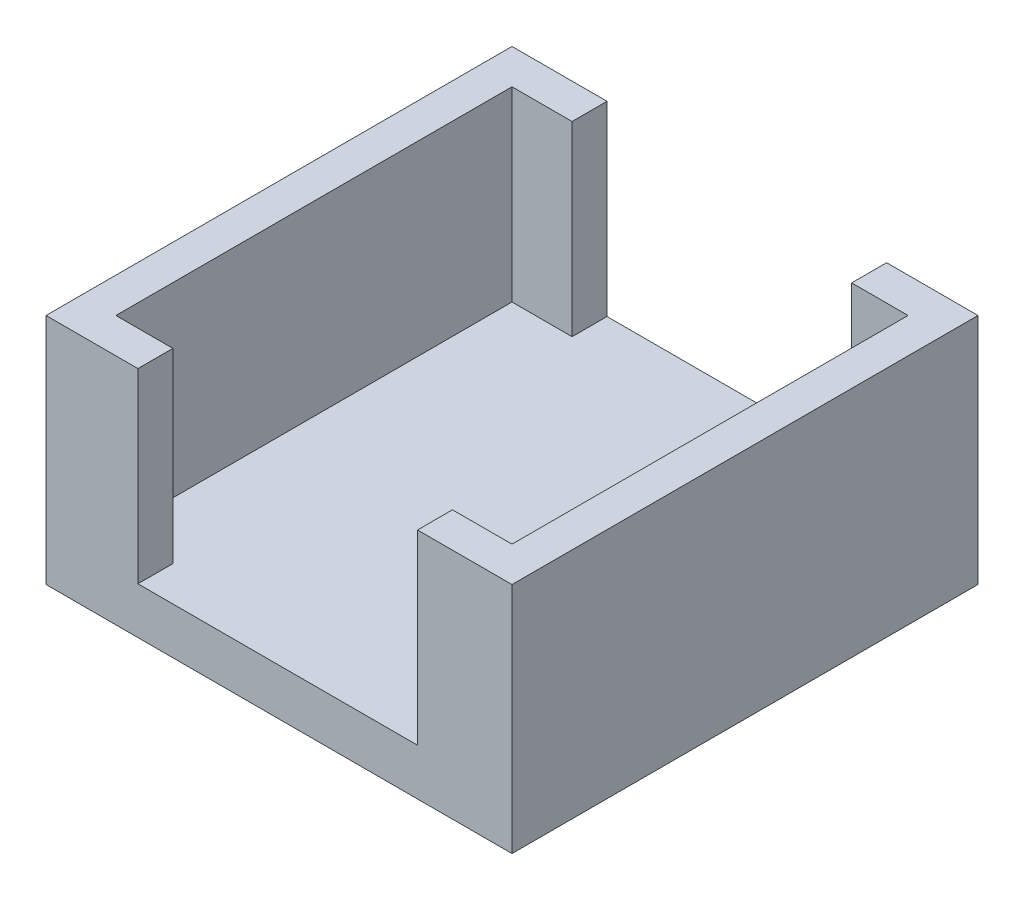
ISO-10303-21;
HEADER;
FILE_DESCRIPTION(('STEP AP214'),'2;1');
FILE_NAME('part.step','',(''),(''),'','','');
FILE_SCHEMA(('AUTOMOTIVE_DESIGN { 1 0 10303 214 1 1 1 1 }'));
ENDSEC;
DATA;
#1=APPLICATION_CONTEXT('core data for automotive mechanical design processes');
#2=APPLICATION_PROTOCOL_DEFINITION('international standard','automotive_design',2000,#1);
#3=PRODUCT_CONTEXT('',#1,'mechanical');
#4=PRODUCT('Part','Part','',(#3));
#5=PRODUCT_RELATED_PRODUCT_CATEGORY('part','',(#4));
#6=PRODUCT_DEFINITION_FORMATION('','',#4);
#7=PRODUCT_DEFINITION_CONTEXT('part definition',#1,'design');
#8=PRODUCT_DEFINITION('design','',#6,#7);
#9=PRODUCT_DEFINITION_SHAPE('','',#8);
#10=(LENGTH_UNIT() NAMED_UNIT(*) SI_UNIT(.MILLI.,.METRE.));
#11=(NAMED_UNIT(*) PLANE_ANGLE_UNIT() SI_UNIT($,.RADIAN.));
#12=(NAMED_UNIT(*) SI_UNIT($,.STERADIAN.) SOLID_ANGLE_UNIT());
#13=UNCERTAINTY_MEASURE_WITH_UNIT(LENGTH_MEASURE(1.E-05),#10,'distance_accuracy_value','');
#14=(GEOMETRIC_REPRESENTATION_CONTEXT(3) GLOBAL_UNCERTAINTY_ASSIGNED_CONTEXT((#13)) GLOBAL_UNIT_ASSIGNED_CONTEXT((#10,
#11,#12)) REPRESENTATION_CONTEXT('',''));
#15=CARTESIAN_POINT('',(0.,0.,0.));
#16=DIRECTION('',(0.,0.,1.));
#17=DIRECTION('',(1.,0.,0.));
#18=AXIS2_PLACEMENT_3D('',#15,#16,#17);
#19=CARTESIAN_POINT('',(0.,10.,0.));
#20=DIRECTION('',(0.,-1.,0.));
#21=DIRECTION('',(0.,0.,-1.));
#22=AXIS2_PLACEMENT_3D('',#19,#20,#21);
#23=PLANE('',#22);
#24=DIRECTION('',(-1.,0.,0.));
#25=VECTOR('',#24,1.);
#26=CARTESIAN_POINT('',(0.,10.,-17.));
#27=LINE('',#26,#25);
#28=CARTESIAN_POINT('',(2.57758231305371,10.,-17.));
#29=VERTEX_POINT('',#28);
#30=CARTESIAN_POINT('',(0.,10.,-17.));
#31=VERTEX_POINT('',#30);
#32=EDGE_CURVE('E167',#29,#31,#27,.T.);
#33=ORIENTED_EDGE('',*,*,#32,.F.);
#34=DIRECTION('',(0.,0.,1.));
#35=VECTOR('',#34,1.);
#36=CARTESIAN_POINT('',(2.57758231305371,10.,-18.5));
#37=LINE('',#36,#35);
#38=CARTESIAN_POINT('',(2.57758231305371,10.,-18.5));
#39=VERTEX_POINT('',#38);
#40=EDGE_CURVE('E152',#39,#29,#37,.T.);
#41=ORIENTED_EDGE('',*,*,#40,.F.);
#42=DIRECTION('',(-1.,0.,0.));
#43=VECTOR('',#42,1.);
#44=CARTESIAN_POINT('',(-1.5,10.,-18.5));
#45=LINE('',#44,#43);
#46=CARTESIAN_POINT('',(-1.5,10.,-18.5));
#47=VERTEX_POINT('',#46);
#48=EDGE_CURVE('E216',#39,#47,#45,.T.);
#49=ORIENTED_EDGE('',*,*,#48,.T.);
#50=DIRECTION('',(0.,0.,1.));
#51=VECTOR('',#50,1.);
#52=CARTESIAN_POINT('',(-1.5,10.,1.5));
#53=LINE('',#52,#51);
#54=CARTESIAN_POINT('',(-1.5,10.,1.5));
#55=VERTEX_POINT('',#54);
#56=EDGE_CURVE('E203',#47,#55,#53,.T.);
#57=ORIENTED_EDGE('',*,*,#56,.T.);
#58=DIRECTION('',(1.,0.,0.));
#59=VECTOR('',#58,1.);
#60=CARTESIAN_POINT('',(-1.5,10.,1.5));
#61=LINE('',#60,#59);
#62=CARTESIAN_POINT('',(2.44538548968437,10.,1.5));
#63=VERTEX_POINT('',#62);
#64=EDGE_CURVE('E208',#55,#63,#61,.T.);
#65=ORIENTED_EDGE('',*,*,#64,.T.);
#66=DIRECTION('',(0.,0.,1.));
#67=VECTOR('',#66,1.);
#68=CARTESIAN_POINT('',(2.44538548968437,10.,0.));
#69=LINE('',#68,#67);
#70=CARTESIAN_POINT('',(2.44538548968437,10.,0.));
#71=VERTEX_POINT('',#70);
#72=EDGE_CURVE('E312',#71,#63,#69,.T.);
#73=ORIENTED_EDGE('',*,*,#72,.F.);
#74=DIRECTION('',(1.,0.,0.));
#75=VECTOR('',#74,1.);
#76=CARTESIAN_POINT('',(0.,10.,0.));
#77=LINE('',#76,#75);
#78=CARTESIAN_POINT('',(0.,10.,0.));
#79=VERTEX_POINT('',#78);
#80=EDGE_CURVE('E185',#79,#71,#77,.T.);
#81=ORIENTED_EDGE('',*,*,#80,.F.);
#82=DIRECTION('',(0.,0.,1.));
#83=VECTOR('',#82,1.);
#84=CARTESIAN_POINT('',(0.,10.,0.));
#85=LINE('',#84,#83);
#86=EDGE_CURVE('E175',#31,#79,#85,.T.);
#87=ORIENTED_EDGE('',*,*,#86,.F.);
#88=EDGE_LOOP('',(#33,#41,#49,#57,#65,#73,#81,#87));
#89=FACE_BOUND('',#88,.T.);
#90=ADVANCED_FACE('F41',(#89),#23,.F.);
#91=CARTESIAN_POINT('',(0.,10.,0.));
#92=DIRECTION('',(0.,0.,-1.));
#93=DIRECTION('',(-1.,0.,0.));
#94=AXIS2_PLACEMENT_3D('',#91,#92,#93);
#95=PLANE('',#94);
#96=DIRECTION('',(0.,1.,0.));
#97=VECTOR('',#96,1.);
#98=CARTESIAN_POINT('',(2.44538548968437,-10.0933866224478,0.));
#99=LINE('',#98,#97);
#100=CARTESIAN_POINT('',(2.44538548968437,2.,0.));
#101=VERTEX_POINT('',#100);
#102=EDGE_CURVE('E295',#101,#71,#99,.T.);
#103=ORIENTED_EDGE('',*,*,#102,.F.);
#104=DIRECTION('',(-1.,0.,0.));
#105=VECTOR('',#104,1.);
#106=CARTESIAN_POINT('',(0.,2.,0.));
#107=LINE('',#106,#105);
#108=CARTESIAN_POINT('',(0.,2.,0.));
#109=VERTEX_POINT('',#108);
#110=EDGE_CURVE('E228',#101,#109,#107,.T.);
#111=ORIENTED_EDGE('',*,*,#110,.T.);
#112=DIRECTION('',(0.,-1.,0.));
#113=VECTOR('',#112,1.);
#114=CARTESIAN_POINT('',(0.,10.,0.));
#115=LINE('',#114,#113);
#116=EDGE_CURVE('E199',#79,#109,#115,.T.);
#117=ORIENTED_EDGE('',*,*,#116,.F.);
#118=ORIENTED_EDGE('',*,*,#80,.T.);
#119=EDGE_LOOP('',(#103,#111,#117,#118));
#120=FACE_BOUND('',#119,.T.);
#121=ADVANCED_FACE('F293',(#120),#95,.T.);
#122=CARTESIAN_POINT('',(0.,10.,-17.));
#123=DIRECTION('',(0.,0.,1.));
#124=DIRECTION('',(1.,0.,0.));
#125=AXIS2_PLACEMENT_3D('',#122,#123,#124);
#126=PLANE('',#125);
#127=DIRECTION('',(0.,1.,0.));
#128=VECTOR('',#127,1.);
#129=CARTESIAN_POINT('',(2.57758231305371,-10.0933866224478,-17.));
#130=LINE('',#129,#128);
#131=CARTESIAN_POINT('',(2.57758231305371,2.,-17.));
#132=VERTEX_POINT('',#131);
#133=EDGE_CURVE('E57',#132,#29,#130,.T.);
#134=ORIENTED_EDGE('',*,*,#133,.T.);
#135=ORIENTED_EDGE('',*,*,#32,.T.);
#136=DIRECTION('',(0.,-1.,0.));
#137=VECTOR('',#136,1.);
#138=CARTESIAN_POINT('',(0.,10.,-17.));
#139=LINE('',#138,#137);
#140=CARTESIAN_POINT('',(0.,2.,-17.));
#141=VERTEX_POINT('',#140);
#142=EDGE_CURVE('E183',#31,#141,#139,.T.);
#143=ORIENTED_EDGE('',*,*,#142,.T.);
#144=DIRECTION('',(1.,0.,0.));
#145=VECTOR('',#144,1.);
#146=CARTESIAN_POINT('',(0.,2.,-17.));
#147=LINE('',#146,#145);
#148=EDGE_CURVE('E169',#141,#132,#147,.T.);
#149=ORIENTED_EDGE('',*,*,#148,.T.);
#150=EDGE_LOOP('',(#134,#135,#143,#149));
#151=FACE_BOUND('',#150,.T.);
#152=ADVANCED_FACE('F165',(#151),#126,.T.);
#153=CARTESIAN_POINT('',(-1.5,2.,0.));
#154=DIRECTION('',(-1.,0.,0.));
#155=DIRECTION('',(0.,0.,1.));
#156=AXIS2_PLACEMENT_3D('',#153,#154,#155);
#157=PLANE('',#156);
#158=DIRECTION('',(0.,0.,-1.));
#159=VECTOR('',#158,1.);
#160=CARTESIAN_POINT('',(-1.5,0.,0.));
#161=LINE('',#160,#159);
#162=CARTESIAN_POINT('',(-1.5,0.,1.5));
#163=VERTEX_POINT('',#162);
#164=CARTESIAN_POINT('',(-1.5,0.,-18.5));
#165=VERTEX_POINT('',#164);
#166=EDGE_CURVE('E237',#163,#165,#161,.T.);
#167=ORIENTED_EDGE('',*,*,#166,.F.);
#168=DIRECTION('',(0.,-1.,0.));
#169=VECTOR('',#168,1.);
#170=CARTESIAN_POINT('',(-1.5,2.,1.5));
#171=LINE('',#170,#169);
#172=EDGE_CURVE('E11',#55,#163,#171,.T.);
#173=ORIENTED_EDGE('',*,*,#172,.F.);
#174=ORIENTED_EDGE('',*,*,#56,.F.);
#175=DIRECTION('',(0.,-1.,0.));
#176=VECTOR('',#175,1.);
#177=CARTESIAN_POINT('',(-1.5,2.,-18.5));
#178=LINE('',#177,#176);
#179=EDGE_CURVE('E252',#47,#165,#178,.T.);
#180=ORIENTED_EDGE('',*,*,#179,.T.);
#181=EDGE_LOOP('',(#167,#173,#174,#180));
#182=FACE_BOUND('',#181,.T.);
#183=ADVANCED_FACE('F43',(#182),#157,.T.);
#184=CARTESIAN_POINT('',(0.,2.,1.5));
#185=DIRECTION('',(0.,0.,-1.));
#186=DIRECTION('',(-1.,0.,0.));
#187=AXIS2_PLACEMENT_3D('',#184,#185,#186);
#188=PLANE('',#187);
#189=DIRECTION('',(-1.,0.,0.));
#190=VECTOR('',#189,1.);
#191=CARTESIAN_POINT('',(2.44538548968437,2.,1.5));
#192=LINE('',#191,#190);
#193=CARTESIAN_POINT('',(14.4453854896844,2.,1.5));
#194=VERTEX_POINT('',#193);
#195=CARTESIAN_POINT('',(2.44538548968437,2.,1.5));
#196=VERTEX_POINT('',#195);
#197=EDGE_CURVE('E161',#194,#196,#192,.T.);
#198=ORIENTED_EDGE('',*,*,#197,.T.);
#199=DIRECTION('',(0.,1.,0.));
#200=VECTOR('',#199,1.);
#201=CARTESIAN_POINT('',(2.44538548968437,-10.0933866224478,1.5));
#202=LINE('',#201,#200);
#203=EDGE_CURVE('E320',#196,#63,#202,.T.);
#204=ORIENTED_EDGE('',*,*,#203,.T.);
#205=ORIENTED_EDGE('',*,*,#64,.F.);
#206=ORIENTED_EDGE('',*,*,#172,.T.);
#207=DIRECTION('',(1.,0.,0.));
#208=VECTOR('',#207,1.);
#209=CARTESIAN_POINT('',(0.,0.,1.5));
#210=LINE('',#209,#208);
#211=CARTESIAN_POINT('',(18.5,0.,1.5));
#212=VERTEX_POINT('',#211);
#213=EDGE_CURVE('E241',#163,#212,#210,.T.);
#214=ORIENTED_EDGE('',*,*,#213,.T.);
#215=DIRECTION('',(0.,-1.,0.));
#216=VECTOR('',#215,1.);
#217=CARTESIAN_POINT('',(18.5,2.,1.5));
#218=LINE('',#217,#216);
#219=CARTESIAN_POINT('',(18.5,10.,1.5));
#220=VERTEX_POINT('',#219);
#221=EDGE_CURVE('E50',#220,#212,#218,.T.);
#222=ORIENTED_EDGE('',*,*,#221,.F.);
#223=CARTESIAN_POINT('',(14.4453854896844,10.,1.5));
#224=VERTEX_POINT('',#223);
#225=EDGE_CURVE('E207',#224,#220,#61,.T.);
#226=ORIENTED_EDGE('',*,*,#225,.F.);
#227=DIRECTION('',(0.,1.,0.));
#228=VECTOR('',#227,1.);
#229=CARTESIAN_POINT('',(14.4453854896844,-10.0933866224478,1.5));
#230=LINE('',#229,#228);
#231=EDGE_CURVE('E331',#194,#224,#230,.T.);
#232=ORIENTED_EDGE('',*,*,#231,.F.);
#233=EDGE_LOOP('',(#198,#204,#205,#206,#214,#222,#226,#232));
#234=FACE_BOUND('',#233,.T.);
#235=ADVANCED_FACE('F335',(#234),#188,.F.);
#236=CARTESIAN_POINT('',(18.5,2.,0.));
#237=DIRECTION('',(-1.,0.,0.));
#238=DIRECTION('',(0.,0.,1.));
#239=AXIS2_PLACEMENT_3D('',#236,#237,#238);
#240=PLANE('',#239);
#241=DIRECTION('',(0.,0.,-1.));
#242=VECTOR('',#241,1.);
#243=CARTESIAN_POINT('',(18.5,0.,0.));
#244=LINE('',#243,#242);
#245=CARTESIAN_POINT('',(18.5,0.,-18.5));
#246=VERTEX_POINT('',#245);
#247=EDGE_CURVE('E244',#212,#246,#244,.T.);
#248=ORIENTED_EDGE('',*,*,#247,.T.);
#249=DIRECTION('',(0.,-1.,0.));
#250=VECTOR('',#249,1.);
#251=CARTESIAN_POINT('',(18.5,2.,-18.5));
#252=LINE('',#251,#250);
#253=CARTESIAN_POINT('',(18.5,10.,-18.5));
#254=VERTEX_POINT('',#253);
#255=EDGE_CURVE('E255',#254,#246,#252,.T.);
#256=ORIENTED_EDGE('',*,*,#255,.F.);
#257=DIRECTION('',(0.,0.,-1.));
#258=VECTOR('',#257,1.);
#259=CARTESIAN_POINT('',(18.5,10.,1.5));
#260=LINE('',#259,#258);
#261=EDGE_CURVE('E212',#220,#254,#260,.T.);
#262=ORIENTED_EDGE('',*,*,#261,.F.);
#263=ORIENTED_EDGE('',*,*,#221,.T.);
#264=EDGE_LOOP('',(#248,#256,#262,#263));
#265=FACE_BOUND('',#264,.T.);
#266=ADVANCED_FACE('F263',(#265),#240,.F.);
#267=CARTESIAN_POINT('',(0.,2.,-18.5));
#268=DIRECTION('',(0.,0.,-1.));
#269=DIRECTION('',(-1.,0.,0.));
#270=AXIS2_PLACEMENT_3D('',#267,#268,#269);
#271=PLANE('',#270);
#272=DIRECTION('',(0.,1.,0.));
#273=VECTOR('',#272,1.);
#274=CARTESIAN_POINT('',(2.57758231305371,-10.0933866224478,-18.5));
#275=LINE('',#274,#273);
#276=CARTESIAN_POINT('',(2.57758231305371,2.,-18.5));
#277=VERTEX_POINT('',#276);
#278=EDGE_CURVE('E155',#277,#39,#275,.T.);
#279=ORIENTED_EDGE('',*,*,#278,.F.);
#280=DIRECTION('',(1.,0.,0.));
#281=VECTOR('',#280,1.);
#282=CARTESIAN_POINT('',(2.57758231305371,2.,-18.5));
#283=LINE('',#282,#281);
#284=CARTESIAN_POINT('',(14.5775823130537,2.,-18.5));
#285=VERTEX_POINT('',#284);
#286=EDGE_CURVE('E306',#277,#285,#283,.T.);
#287=ORIENTED_EDGE('',*,*,#286,.T.);
#288=DIRECTION('',(0.,1.,0.));
#289=VECTOR('',#288,1.);
#290=CARTESIAN_POINT('',(14.5775823130537,-10.0933866224478,-18.5));
#291=LINE('',#290,#289);
#292=CARTESIAN_POINT('',(14.5775823130537,10.,-18.5));
#293=VERTEX_POINT('',#292);
#294=EDGE_CURVE('E344',#285,#293,#291,.T.);
#295=ORIENTED_EDGE('',*,*,#294,.T.);
#296=EDGE_CURVE('E217',#254,#293,#45,.T.);
#297=ORIENTED_EDGE('',*,*,#296,.F.);
#298=ORIENTED_EDGE('',*,*,#255,.T.);
#299=DIRECTION('',(1.,0.,0.));
#300=VECTOR('',#299,1.);
#301=CARTESIAN_POINT('',(0.,0.,-18.5));
#302=LINE('',#301,#300);
#303=EDGE_CURVE('E248',#165,#246,#302,.T.);
#304=ORIENTED_EDGE('',*,*,#303,.F.);
#305=ORIENTED_EDGE('',*,*,#179,.F.);
#306=ORIENTED_EDGE('',*,*,#48,.F.);
#307=EDGE_LOOP('',(#279,#287,#295,#297,#298,#304,#305,#306));
#308=FACE_BOUND('',#307,.T.);
#309=ADVANCED_FACE('F273',(#308),#271,.T.);
#310=CARTESIAN_POINT('',(0.,0.,0.));
#311=DIRECTION('',(0.,1.,0.));
#312=DIRECTION('',(0.,0.,1.));
#313=AXIS2_PLACEMENT_3D('',#310,#311,#312);
#314=PLANE('',#313);
#315=ORIENTED_EDGE('',*,*,#166,.T.);
#316=ORIENTED_EDGE('',*,*,#303,.T.);
#317=ORIENTED_EDGE('',*,*,#247,.F.);
#318=ORIENTED_EDGE('',*,*,#213,.F.);
#319=EDGE_LOOP('',(#315,#316,#317,#318));
#320=FACE_BOUND('',#319,.T.);
#321=ADVANCED_FACE('F268',(#320),#314,.F.);
#322=ORIENTED_EDGE('',*,*,#296,.T.);
#323=DIRECTION('',(0.,0.,-1.));
#324=VECTOR('',#323,1.);
#325=CARTESIAN_POINT('',(14.5775823130537,10.,-18.5));
#326=LINE('',#325,#324);
#327=CARTESIAN_POINT('',(14.5775823130537,10.,-17.));
#328=VERTEX_POINT('',#327);
#329=EDGE_CURVE('E160',#328,#293,#326,.T.);
#330=ORIENTED_EDGE('',*,*,#329,.F.);
#331=CARTESIAN_POINT('',(17.,10.,-17.));
#332=VERTEX_POINT('',#331);
#333=EDGE_CURVE('E177',#332,#328,#27,.T.);
#334=ORIENTED_EDGE('',*,*,#333,.F.);
#335=DIRECTION('',(0.,0.,-1.));
#336=VECTOR('',#335,1.);
#337=CARTESIAN_POINT('',(17.,10.,0.));
#338=LINE('',#337,#336);
#339=CARTESIAN_POINT('',(17.,10.,0.));
#340=VERTEX_POINT('',#339);
#341=EDGE_CURVE('E178',#340,#332,#338,.T.);
#342=ORIENTED_EDGE('',*,*,#341,.F.);
#343=CARTESIAN_POINT('',(14.4453854896844,10.,0.));
#344=VERTEX_POINT('',#343);
#345=EDGE_CURVE('E301',#344,#340,#77,.T.);
#346=ORIENTED_EDGE('',*,*,#345,.F.);
#347=DIRECTION('',(0.,0.,-1.));
#348=VECTOR('',#347,1.);
#349=CARTESIAN_POINT('',(14.4453854896844,10.,0.));
#350=LINE('',#349,#348);
#351=EDGE_CURVE('E282',#224,#344,#350,.T.);
#352=ORIENTED_EDGE('',*,*,#351,.F.);
#353=ORIENTED_EDGE('',*,*,#225,.T.);
#354=ORIENTED_EDGE('',*,*,#261,.T.);
#355=EDGE_LOOP('',(#322,#330,#334,#342,#346,#352,#353,#354));
#356=FACE_BOUND('',#355,.T.);
#357=ADVANCED_FACE('F278',(#356),#23,.F.);
#358=CARTESIAN_POINT('',(0.,10.,0.));
#359=DIRECTION('',(1.,0.,0.));
#360=DIRECTION('',(0.,0.,-1.));
#361=AXIS2_PLACEMENT_3D('',#358,#359,#360);
#362=PLANE('',#361);
#363=ORIENTED_EDGE('',*,*,#116,.T.);
#364=DIRECTION('',(0.,0.,-1.));
#365=VECTOR('',#364,1.);
#366=CARTESIAN_POINT('',(0.,2.,0.));
#367=LINE('',#366,#365);
#368=EDGE_CURVE('E233',#109,#141,#367,.T.);
#369=ORIENTED_EDGE('',*,*,#368,.T.);
#370=ORIENTED_EDGE('',*,*,#142,.F.);
#371=ORIENTED_EDGE('',*,*,#86,.T.);
#372=EDGE_LOOP('',(#363,#369,#370,#371));
#373=FACE_BOUND('',#372,.T.);
#374=ADVANCED_FACE('F299',(#373),#362,.T.);
#375=DIRECTION('',(0.,1.,0.));
#376=VECTOR('',#375,1.);
#377=CARTESIAN_POINT('',(14.4453854896844,-10.0933866224478,0.));
#378=LINE('',#377,#376);
#379=CARTESIAN_POINT('',(14.4453854896844,2.,0.));
#380=VERTEX_POINT('',#379);
#381=EDGE_CURVE('E65',#380,#344,#378,.T.);
#382=ORIENTED_EDGE('',*,*,#381,.T.);
#383=ORIENTED_EDGE('',*,*,#345,.T.);
#384=DIRECTION('',(0.,-1.,0.));
#385=VECTOR('',#384,1.);
#386=CARTESIAN_POINT('',(17.,10.,0.));
#387=LINE('',#386,#385);
#388=CARTESIAN_POINT('',(17.,2.,0.));
#389=VERTEX_POINT('',#388);
#390=EDGE_CURVE('E195',#340,#389,#387,.T.);
#391=ORIENTED_EDGE('',*,*,#390,.T.);
#392=EDGE_CURVE('E229',#389,#380,#107,.T.);
#393=ORIENTED_EDGE('',*,*,#392,.T.);
#394=EDGE_LOOP('',(#382,#383,#391,#393));
#395=FACE_BOUND('',#394,.T.);
#396=ADVANCED_FACE('F383',(#395),#95,.T.);
#397=CARTESIAN_POINT('',(17.,10.,0.));
#398=DIRECTION('',(-1.,0.,0.));
#399=DIRECTION('',(0.,0.,1.));
#400=AXIS2_PLACEMENT_3D('',#397,#398,#399);
#401=PLANE('',#400);
#402=DIRECTION('',(0.,-1.,0.));
#403=VECTOR('',#402,1.);
#404=CARTESIAN_POINT('',(17.,10.,-17.));
#405=LINE('',#404,#403);
#406=CARTESIAN_POINT('',(17.,2.,-17.));
#407=VERTEX_POINT('',#406);
#408=EDGE_CURVE('E191',#332,#407,#405,.T.);
#409=ORIENTED_EDGE('',*,*,#408,.T.);
#410=DIRECTION('',(0.,0.,1.));
#411=VECTOR('',#410,1.);
#412=CARTESIAN_POINT('',(17.,2.,0.));
#413=LINE('',#412,#411);
#414=EDGE_CURVE('E224',#407,#389,#413,.T.);
#415=ORIENTED_EDGE('',*,*,#414,.T.);
#416=ORIENTED_EDGE('',*,*,#390,.F.);
#417=ORIENTED_EDGE('',*,*,#341,.T.);
#418=EDGE_LOOP('',(#409,#415,#416,#417));
#419=FACE_BOUND('',#418,.T.);
#420=ADVANCED_FACE('F368',(#419),#401,.T.);
#421=DIRECTION('',(0.,1.,0.));
#422=VECTOR('',#421,1.);
#423=CARTESIAN_POINT('',(14.5775823130537,-10.0933866224478,-17.));
#424=LINE('',#423,#422);
#425=CARTESIAN_POINT('',(14.5775823130537,2.,-17.));
#426=VERTEX_POINT('',#425);
#427=EDGE_CURVE('E171',#426,#328,#424,.T.);
#428=ORIENTED_EDGE('',*,*,#427,.F.);
#429=EDGE_CURVE('E221',#426,#407,#147,.T.);
#430=ORIENTED_EDGE('',*,*,#429,.T.);
#431=ORIENTED_EDGE('',*,*,#408,.F.);
#432=ORIENTED_EDGE('',*,*,#333,.T.);
#433=EDGE_LOOP('',(#428,#430,#431,#432));
#434=FACE_BOUND('',#433,.T.);
#435=ADVANCED_FACE('F363',(#434),#126,.T.);
#436=CARTESIAN_POINT('',(0.,2.,0.));
#437=DIRECTION('',(0.,1.,0.));
#438=DIRECTION('',(0.,0.,1.));
#439=AXIS2_PLACEMENT_3D('',#436,#437,#438);
#440=PLANE('',#439);
#441=ORIENTED_EDGE('',*,*,#368,.F.);
#442=ORIENTED_EDGE('',*,*,#110,.F.);
#443=DIRECTION('',(0.,0.,-1.));
#444=VECTOR('',#443,1.);
#445=CARTESIAN_POINT('',(2.44538548968437,2.,0.));
#446=LINE('',#445,#444);
#447=EDGE_CURVE('E323',#196,#101,#446,.T.);
#448=ORIENTED_EDGE('',*,*,#447,.F.);
#449=ORIENTED_EDGE('',*,*,#197,.F.);
#450=DIRECTION('',(0.,0.,1.));
#451=VECTOR('',#450,1.);
#452=CARTESIAN_POINT('',(14.4453854896844,2.,0.));
#453=LINE('',#452,#451);
#454=EDGE_CURVE('E328',#380,#194,#453,.T.);
#455=ORIENTED_EDGE('',*,*,#454,.F.);
#456=ORIENTED_EDGE('',*,*,#392,.F.);
#457=ORIENTED_EDGE('',*,*,#414,.F.);
#458=ORIENTED_EDGE('',*,*,#429,.F.);
#459=DIRECTION('',(0.,0.,1.));
#460=VECTOR('',#459,1.);
#461=CARTESIAN_POINT('',(14.5775823130537,2.,-18.5));
#462=LINE('',#461,#460);
#463=EDGE_CURVE('E349',#285,#426,#462,.T.);
#464=ORIENTED_EDGE('',*,*,#463,.F.);
#465=ORIENTED_EDGE('',*,*,#286,.F.);
#466=DIRECTION('',(0.,0.,-1.));
#467=VECTOR('',#466,1.);
#468=CARTESIAN_POINT('',(2.57758231305371,2.,-18.5));
#469=LINE('',#468,#467);
#470=EDGE_CURVE('E302',#132,#277,#469,.T.);
#471=ORIENTED_EDGE('',*,*,#470,.F.);
#472=ORIENTED_EDGE('',*,*,#148,.F.);
#473=EDGE_LOOP('',(#441,#442,#448,#449,#455,#456,#457,#458,#464,#465,#471,#472));
#474=FACE_BOUND('',#473,.T.);
#475=ADVANCED_FACE('F297',(#474),#440,.T.);
#476=CARTESIAN_POINT('',(2.44538548968437,-10.0933866224478,0.));
#477=DIRECTION('',(-1.,0.,0.));
#478=DIRECTION('',(0.,0.,1.));
#479=AXIS2_PLACEMENT_3D('',#476,#477,#478);
#480=PLANE('',#479);
#481=ORIENTED_EDGE('',*,*,#447,.T.);
#482=ORIENTED_EDGE('',*,*,#102,.T.);
#483=ORIENTED_EDGE('',*,*,#72,.T.);
#484=ORIENTED_EDGE('',*,*,#203,.F.);
#485=EDGE_LOOP('',(#481,#482,#483,#484));
#486=FACE_BOUND('',#485,.T.);
#487=ADVANCED_FACE('F337',(#486),#480,.F.);
#488=CARTESIAN_POINT('',(14.4453854896844,-10.0933866224478,0.));
#489=DIRECTION('',(1.,0.,0.));
#490=DIRECTION('',(0.,0.,-1.));
#491=AXIS2_PLACEMENT_3D('',#488,#489,#490);
#492=PLANE('',#491);
#493=ORIENTED_EDGE('',*,*,#454,.T.);
#494=ORIENTED_EDGE('',*,*,#231,.T.);
#495=ORIENTED_EDGE('',*,*,#351,.T.);
#496=ORIENTED_EDGE('',*,*,#381,.F.);
#497=EDGE_LOOP('',(#493,#494,#495,#496));
#498=FACE_BOUND('',#497,.T.);
#499=ADVANCED_FACE('F451',(#498),#492,.F.);
#500=CARTESIAN_POINT('',(2.57758231305371,-10.0933866224478,-18.5));
#501=DIRECTION('',(-1.,0.,0.));
#502=DIRECTION('',(0.,0.,1.));
#503=AXIS2_PLACEMENT_3D('',#500,#501,#502);
#504=PLANE('',#503);
#505=ORIENTED_EDGE('',*,*,#470,.T.);
#506=ORIENTED_EDGE('',*,*,#278,.T.);
#507=ORIENTED_EDGE('',*,*,#40,.T.);
#508=ORIENTED_EDGE('',*,*,#133,.F.);
#509=EDGE_LOOP('',(#505,#506,#507,#508));
#510=FACE_BOUND('',#509,.T.);
#511=ADVANCED_FACE('F153',(#510),#504,.F.);
#512=CARTESIAN_POINT('',(14.5775823130537,-10.0933866224478,-18.5));
#513=DIRECTION('',(1.,0.,0.));
#514=DIRECTION('',(0.,0.,-1.));
#515=AXIS2_PLACEMENT_3D('',#512,#513,#514);
#516=PLANE('',#515);
#517=ORIENTED_EDGE('',*,*,#463,.T.);
#518=ORIENTED_EDGE('',*,*,#427,.T.);
#519=ORIENTED_EDGE('',*,*,#329,.T.);
#520=ORIENTED_EDGE('',*,*,#294,.F.);
#521=EDGE_LOOP('',(#517,#518,#519,#520));
#522=FACE_BOUND('',#521,.T.);
#523=ADVANCED_FACE('F359',(#522),#516,.F.);
#524=CLOSED_SHELL('',(#90,#121,#152,#183,#235,#266,#309,#321,#357,#374,#396,#420,#435,#475,#487,
#499,#511,#523));
#525=MANIFOLD_SOLID_BREP('B2',#524);
#526=ADVANCED_BREP_SHAPE_REPRESENTATION('',(#18,#525),#14);
#527=SHAPE_DEFINITION_REPRESENTATION(#9,#526);
ENDSEC;
END-ISO-10303-21;
